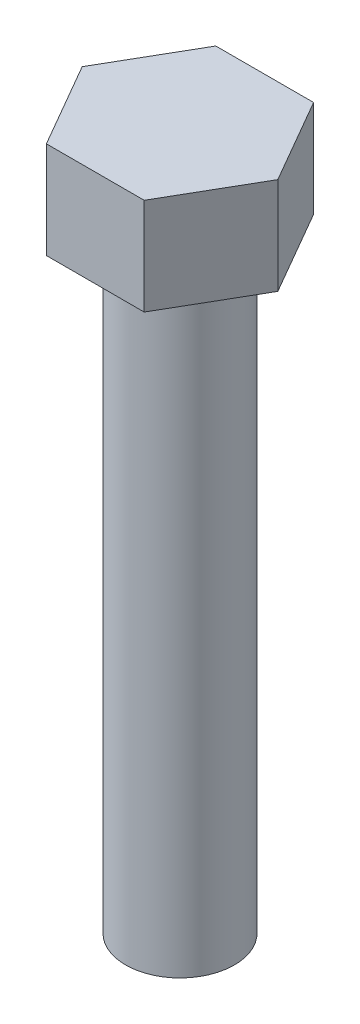
ISO-10303-21;
HEADER;
FILE_DESCRIPTION(('STEP AP214'),'2;1');
FILE_NAME('part.step','',(''),(''),'','','');
FILE_SCHEMA(('AUTOMOTIVE_DESIGN { 1 0 10303 214 1 1 1 1 }'));
ENDSEC;
DATA;
#1=APPLICATION_CONTEXT('core data for automotive mechanical design processes');
#2=APPLICATION_PROTOCOL_DEFINITION('international standard','automotive_design',2000,#1);
#3=PRODUCT_CONTEXT('',#1,'mechanical');
#4=PRODUCT('Part','Part','',(#3));
#5=PRODUCT_RELATED_PRODUCT_CATEGORY('part','',(#4));
#6=PRODUCT_DEFINITION_FORMATION('','',#4);
#7=PRODUCT_DEFINITION_CONTEXT('part definition',#1,'design');
#8=PRODUCT_DEFINITION('design','',#6,#7);
#9=PRODUCT_DEFINITION_SHAPE('','',#8);
#10=(LENGTH_UNIT() NAMED_UNIT(*) SI_UNIT(.MILLI.,.METRE.));
#11=(NAMED_UNIT(*) PLANE_ANGLE_UNIT() SI_UNIT($,.RADIAN.));
#12=(NAMED_UNIT(*) SI_UNIT($,.STERADIAN.) SOLID_ANGLE_UNIT());
#13=UNCERTAINTY_MEASURE_WITH_UNIT(LENGTH_MEASURE(1.E-05),#10,'distance_accuracy_value','');
#14=(GEOMETRIC_REPRESENTATION_CONTEXT(3) GLOBAL_UNCERTAINTY_ASSIGNED_CONTEXT((#13)) GLOBAL_UNIT_ASSIGNED_CONTEXT((#10,
#11,#12)) REPRESENTATION_CONTEXT('',''));
#15=CARTESIAN_POINT('',(0.,0.,0.));
#16=DIRECTION('',(0.,0.,1.));
#17=DIRECTION('',(1.,0.,0.));
#18=AXIS2_PLACEMENT_3D('',#15,#16,#17);
#19=CARTESIAN_POINT('',(2.25,0.,0.));
#20=DIRECTION('',(0.,-1.,0.));
#21=DIRECTION('',(0.,0.,-1.));
#22=AXIS2_PLACEMENT_3D('',#19,#20,#21);
#23=PLANE('',#22);
#24=CARTESIAN_POINT('',(0.,0.,0.));
#25=DIRECTION('',(0.,-1.,0.));
#26=DIRECTION('',(0.,0.,-1.));
#27=AXIS2_PLACEMENT_3D('',#24,#25,#26);
#28=CIRCLE('',#27,2.25);
#29=CARTESIAN_POINT('',(0.,0.,-2.25));
#30=VERTEX_POINT('',#29);
#31=EDGE_CURVE('E11',#30,#30,#28,.T.);
#32=ORIENTED_EDGE('',*,*,#31,.T.);
#33=EDGE_LOOP('',(#32));
#34=FACE_BOUND('',#33,.T.);
#35=ADVANCED_FACE('F43',(#34),#23,.T.);
#36=CARTESIAN_POINT('',(0.,0.,0.));
#37=DIRECTION('',(0.,-1.,0.));
#38=DIRECTION('',(0.,0.,-1.));
#39=AXIS2_PLACEMENT_3D('',#36,#37,#38);
#40=CYLINDRICAL_SURFACE('',#39,2.25);
#41=CARTESIAN_POINT('',(0.,25.,0.));
#42=DIRECTION('',(0.,-1.,0.));
#43=DIRECTION('',(0.,0.,-1.));
#44=AXIS2_PLACEMENT_3D('',#41,#42,#43);
#45=CIRCLE('',#44,2.25);
#46=CARTESIAN_POINT('',(0.,25.,-2.25));
#47=VERTEX_POINT('',#46);
#48=EDGE_CURVE('E46',#47,#47,#45,.T.);
#49=ORIENTED_EDGE('',*,*,#48,.T.);
#50=EDGE_LOOP('',(#49));
#51=FACE_BOUND('',#50,.T.);
#52=ORIENTED_EDGE('',*,*,#31,.F.);
#53=EDGE_LOOP('',(#52));
#54=FACE_BOUND('',#53,.T.);
#55=ADVANCED_FACE('F150',(#51,#54),#40,.T.);
#56=CARTESIAN_POINT('',(2.02072594216369,29.,3.5));
#57=DIRECTION('',(-0.866025403784439,0.,-0.5));
#58=DIRECTION('',(-0.5,0.,0.866025403784439));
#59=AXIS2_PLACEMENT_3D('',#56,#57,#58);
#60=PLANE('',#59);
#61=DIRECTION('',(0.5,0.,-0.866025403784439));
#62=VECTOR('',#61,1.);
#63=CARTESIAN_POINT('',(2.02072594216369,25.,3.5));
#64=LINE('',#63,#62);
#65=CARTESIAN_POINT('',(2.02072594216369,25.,3.5));
#66=VERTEX_POINT('',#65);
#67=CARTESIAN_POINT('',(4.04145188432738,25.,0.));
#68=VERTEX_POINT('',#67);
#69=EDGE_CURVE('E128',#66,#68,#64,.T.);
#70=ORIENTED_EDGE('',*,*,#69,.T.);
#71=DIRECTION('',(0.,-1.,0.));
#72=VECTOR('',#71,1.);
#73=CARTESIAN_POINT('',(4.04145188432738,29.,0.));
#74=LINE('',#73,#72);
#75=CARTESIAN_POINT('',(4.04145188432738,29.,0.));
#76=VERTEX_POINT('',#75);
#77=EDGE_CURVE('E145',#76,#68,#74,.T.);
#78=ORIENTED_EDGE('',*,*,#77,.F.);
#79=DIRECTION('',(0.5,0.,-0.866025403784439));
#80=VECTOR('',#79,1.);
#81=CARTESIAN_POINT('',(2.02072594216369,29.,3.5));
#82=LINE('',#81,#80);
#83=CARTESIAN_POINT('',(2.02072594216369,29.,3.5));
#84=VERTEX_POINT('',#83);
#85=EDGE_CURVE('E138',#84,#76,#82,.T.);
#86=ORIENTED_EDGE('',*,*,#85,.F.);
#87=DIRECTION('',(0.,-1.,0.));
#88=VECTOR('',#87,1.);
#89=CARTESIAN_POINT('',(2.02072594216369,29.,3.5));
#90=LINE('',#89,#88);
#91=EDGE_CURVE('E124',#84,#66,#90,.T.);
#92=ORIENTED_EDGE('',*,*,#91,.T.);
#93=EDGE_LOOP('',(#70,#78,#86,#92));
#94=FACE_BOUND('',#93,.T.);
#95=ADVANCED_FACE('F160',(#94),#60,.F.);
#96=CARTESIAN_POINT('',(4.04145188432738,29.,0.));
#97=DIRECTION('',(-0.866025403784438,0.,0.500000000000001));
#98=DIRECTION('',(0.500000000000001,0.,0.866025403784438));
#99=AXIS2_PLACEMENT_3D('',#96,#97,#98);
#100=PLANE('',#99);
#101=DIRECTION('',(-0.500000000000001,0.,-0.866025403784438));
#102=VECTOR('',#101,1.);
#103=CARTESIAN_POINT('',(4.04145188432738,25.,0.));
#104=LINE('',#103,#102);
#105=CARTESIAN_POINT('',(2.02072594216369,25.,-3.5));
#106=VERTEX_POINT('',#105);
#107=EDGE_CURVE('E131',#68,#106,#104,.T.);
#108=ORIENTED_EDGE('',*,*,#107,.T.);
#109=DIRECTION('',(0.,-1.,0.));
#110=VECTOR('',#109,1.);
#111=CARTESIAN_POINT('',(2.02072594216369,29.,-3.5));
#112=LINE('',#111,#110);
#113=CARTESIAN_POINT('',(2.02072594216369,29.,-3.5));
#114=VERTEX_POINT('',#113);
#115=EDGE_CURVE('E142',#114,#106,#112,.T.);
#116=ORIENTED_EDGE('',*,*,#115,.F.);
#117=DIRECTION('',(-0.500000000000001,0.,-0.866025403784438));
#118=VECTOR('',#117,1.);
#119=CARTESIAN_POINT('',(4.04145188432738,29.,0.));
#120=LINE('',#119,#118);
#121=EDGE_CURVE('E97',#76,#114,#120,.T.);
#122=ORIENTED_EDGE('',*,*,#121,.F.);
#123=ORIENTED_EDGE('',*,*,#77,.T.);
#124=EDGE_LOOP('',(#108,#116,#122,#123));
#125=FACE_BOUND('',#124,.T.);
#126=ADVANCED_FACE('F180',(#125),#100,.F.);
#127=CARTESIAN_POINT('',(2.02072594216369,29.,-3.5));
#128=DIRECTION('',(0.,0.,1.));
#129=DIRECTION('',(1.,0.,0.));
#130=AXIS2_PLACEMENT_3D('',#127,#128,#129);
#131=PLANE('',#130);
#132=DIRECTION('',(-1.,0.,0.));
#133=VECTOR('',#132,1.);
#134=CARTESIAN_POINT('',(2.02072594216369,25.,-3.5));
#135=LINE('',#134,#133);
#136=CARTESIAN_POINT('',(-2.02072594216369,25.,-3.5));
#137=VERTEX_POINT('',#136);
#138=EDGE_CURVE('E133',#106,#137,#135,.T.);
#139=ORIENTED_EDGE('',*,*,#138,.T.);
#140=DIRECTION('',(0.,-1.,0.));
#141=VECTOR('',#140,1.);
#142=CARTESIAN_POINT('',(-2.02072594216369,29.,-3.5));
#143=LINE('',#142,#141);
#144=CARTESIAN_POINT('',(-2.02072594216369,29.,-3.5));
#145=VERTEX_POINT('',#144);
#146=EDGE_CURVE('E119',#145,#137,#143,.T.);
#147=ORIENTED_EDGE('',*,*,#146,.F.);
#148=DIRECTION('',(-1.,0.,0.));
#149=VECTOR('',#148,1.);
#150=CARTESIAN_POINT('',(2.02072594216369,29.,-3.5));
#151=LINE('',#150,#149);
#152=EDGE_CURVE('E110',#114,#145,#151,.T.);
#153=ORIENTED_EDGE('',*,*,#152,.F.);
#154=ORIENTED_EDGE('',*,*,#115,.T.);
#155=EDGE_LOOP('',(#139,#147,#153,#154));
#156=FACE_BOUND('',#155,.T.);
#157=ADVANCED_FACE('F185',(#156),#131,.F.);
#158=CARTESIAN_POINT('',(-2.02072594216369,29.,-3.5));
#159=DIRECTION('',(0.866025403784439,0.,0.5));
#160=DIRECTION('',(0.5,0.,-0.866025403784438));
#161=AXIS2_PLACEMENT_3D('',#158,#159,#160);
#162=PLANE('',#161);
#163=DIRECTION('',(-0.5,0.,0.866025403784438));
#164=VECTOR('',#163,1.);
#165=CARTESIAN_POINT('',(-2.02072594216369,25.,-3.5));
#166=LINE('',#165,#164);
#167=CARTESIAN_POINT('',(-4.04145188432738,25.,0.));
#168=VERTEX_POINT('',#167);
#169=EDGE_CURVE('E118',#137,#168,#166,.T.);
#170=ORIENTED_EDGE('',*,*,#169,.T.);
#171=DIRECTION('',(0.,-1.,0.));
#172=VECTOR('',#171,1.);
#173=CARTESIAN_POINT('',(-4.04145188432738,29.,0.));
#174=LINE('',#173,#172);
#175=CARTESIAN_POINT('',(-4.04145188432738,29.,0.));
#176=VERTEX_POINT('',#175);
#177=EDGE_CURVE('E115',#176,#168,#174,.T.);
#178=ORIENTED_EDGE('',*,*,#177,.F.);
#179=DIRECTION('',(-0.5,0.,0.866025403784438));
#180=VECTOR('',#179,1.);
#181=CARTESIAN_POINT('',(-2.02072594216369,29.,-3.5));
#182=LINE('',#181,#180);
#183=EDGE_CURVE('E104',#145,#176,#182,.T.);
#184=ORIENTED_EDGE('',*,*,#183,.F.);
#185=ORIENTED_EDGE('',*,*,#146,.T.);
#186=EDGE_LOOP('',(#170,#178,#184,#185));
#187=FACE_BOUND('',#186,.T.);
#188=ADVANCED_FACE('F116',(#187),#162,.F.);
#189=CARTESIAN_POINT('',(-4.04145188432738,29.,0.));
#190=DIRECTION('',(0.866025403784439,0.,-0.5));
#191=DIRECTION('',(-0.5,0.,-0.866025403784439));
#192=AXIS2_PLACEMENT_3D('',#189,#190,#191);
#193=PLANE('',#192);
#194=DIRECTION('',(0.5,0.,0.866025403784439));
#195=VECTOR('',#194,1.);
#196=CARTESIAN_POINT('',(-4.04145188432738,25.,0.));
#197=LINE('',#196,#195);
#198=CARTESIAN_POINT('',(-2.02072594216369,25.,3.5));
#199=VERTEX_POINT('',#198);
#200=EDGE_CURVE('E82',#168,#199,#197,.T.);
#201=ORIENTED_EDGE('',*,*,#200,.T.);
#202=DIRECTION('',(0.,-1.,0.));
#203=VECTOR('',#202,1.);
#204=CARTESIAN_POINT('',(-2.02072594216369,29.,3.5));
#205=LINE('',#204,#203);
#206=CARTESIAN_POINT('',(-2.02072594216369,29.,3.5));
#207=VERTEX_POINT('',#206);
#208=EDGE_CURVE('E120',#207,#199,#205,.T.);
#209=ORIENTED_EDGE('',*,*,#208,.F.);
#210=DIRECTION('',(0.5,0.,0.866025403784439));
#211=VECTOR('',#210,1.);
#212=CARTESIAN_POINT('',(-4.04145188432738,29.,0.));
#213=LINE('',#212,#211);
#214=EDGE_CURVE('E108',#176,#207,#213,.T.);
#215=ORIENTED_EDGE('',*,*,#214,.F.);
#216=ORIENTED_EDGE('',*,*,#177,.T.);
#217=EDGE_LOOP('',(#201,#209,#215,#216));
#218=FACE_BOUND('',#217,.T.);
#219=ADVANCED_FACE('F122',(#218),#193,.F.);
#220=CARTESIAN_POINT('',(-2.02072594216369,29.,3.5));
#221=DIRECTION('',(0.,0.,-1.));
#222=DIRECTION('',(-1.,0.,0.));
#223=AXIS2_PLACEMENT_3D('',#220,#221,#222);
#224=PLANE('',#223);
#225=DIRECTION('',(1.,0.,0.));
#226=VECTOR('',#225,1.);
#227=CARTESIAN_POINT('',(-2.02072594216369,25.,3.5));
#228=LINE('',#227,#226);
#229=EDGE_CURVE('E88',#199,#66,#228,.T.);
#230=ORIENTED_EDGE('',*,*,#229,.T.);
#231=ORIENTED_EDGE('',*,*,#91,.F.);
#232=DIRECTION('',(1.,0.,0.));
#233=VECTOR('',#232,1.);
#234=CARTESIAN_POINT('',(-2.02072594216369,29.,3.5));
#235=LINE('',#234,#233);
#236=EDGE_CURVE('E59',#207,#84,#235,.T.);
#237=ORIENTED_EDGE('',*,*,#236,.F.);
#238=ORIENTED_EDGE('',*,*,#208,.T.);
#239=EDGE_LOOP('',(#230,#231,#237,#238));
#240=FACE_BOUND('',#239,.T.);
#241=ADVANCED_FACE('F162',(#240),#224,.F.);
#242=CARTESIAN_POINT('',(0.,29.,0.));
#243=DIRECTION('',(0.,1.,0.));
#244=DIRECTION('',(0.,0.,1.));
#245=AXIS2_PLACEMENT_3D('',#242,#243,#244);
#246=PLANE('',#245);
#247=ORIENTED_EDGE('',*,*,#85,.T.);
#248=ORIENTED_EDGE('',*,*,#121,.T.);
#249=ORIENTED_EDGE('',*,*,#152,.T.);
#250=ORIENTED_EDGE('',*,*,#183,.T.);
#251=ORIENTED_EDGE('',*,*,#214,.T.);
#252=ORIENTED_EDGE('',*,*,#236,.T.);
#253=EDGE_LOOP('',(#247,#248,#249,#250,#251,#252));
#254=FACE_BOUND('',#253,.T.);
#255=ADVANCED_FACE('F106',(#254),#246,.T.);
#256=CARTESIAN_POINT('',(0.,25.,0.));
#257=DIRECTION('',(0.,1.,0.));
#258=DIRECTION('',(0.,0.,1.));
#259=AXIS2_PLACEMENT_3D('',#256,#257,#258);
#260=PLANE('',#259);
#261=ORIENTED_EDGE('',*,*,#48,.F.);
#262=EDGE_LOOP('',(#261));
#263=FACE_BOUND('',#262,.T.);
#264=ORIENTED_EDGE('',*,*,#69,.F.);
#265=ORIENTED_EDGE('',*,*,#229,.F.);
#266=ORIENTED_EDGE('',*,*,#200,.F.);
#267=ORIENTED_EDGE('',*,*,#169,.F.);
#268=ORIENTED_EDGE('',*,*,#138,.F.);
#269=ORIENTED_EDGE('',*,*,#107,.F.);
#270=EDGE_LOOP('',(#264,#265,#266,#267,#268,#269));
#271=FACE_BOUND('',#270,.T.);
#272=ADVANCED_FACE('F153',(#263,#271),#260,.F.);
#273=CLOSED_SHELL('',(#35,#55,#95,#126,#157,#188,#219,#241,#255,#272));
#274=MANIFOLD_SOLID_BREP('B2',#273);
#275=ADVANCED_BREP_SHAPE_REPRESENTATION('',(#18,#274),#14);
#276=SHAPE_DEFINITION_REPRESENTATION(#9,#275);
ENDSEC;
END-ISO-10303-21;
